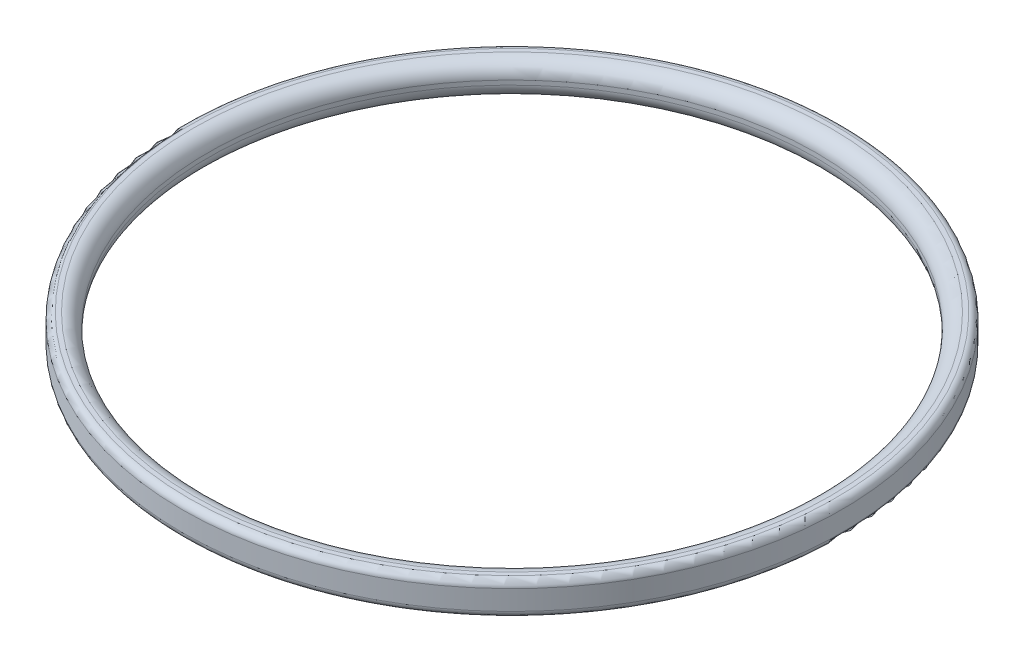
ISO-10303-21;
HEADER;
FILE_DESCRIPTION(('STEP AP214'),'2;1');
FILE_NAME('part.step','',(''),(''),'','','');
FILE_SCHEMA(('AUTOMOTIVE_DESIGN { 1 0 10303 214 1 1 1 1 }'));
ENDSEC;
DATA;
#1=APPLICATION_CONTEXT('core data for automotive mechanical design processes');
#2=APPLICATION_PROTOCOL_DEFINITION('international standard','automotive_design',2000,#1);
#3=PRODUCT_CONTEXT('',#1,'mechanical');
#4=PRODUCT('Part','Part','',(#3));
#5=PRODUCT_RELATED_PRODUCT_CATEGORY('part','',(#4));
#6=PRODUCT_DEFINITION_FORMATION('','',#4);
#7=PRODUCT_DEFINITION_CONTEXT('part definition',#1,'design');
#8=PRODUCT_DEFINITION('design','',#6,#7);
#9=PRODUCT_DEFINITION_SHAPE('','',#8);
#10=(LENGTH_UNIT() NAMED_UNIT(*) SI_UNIT(.MILLI.,.METRE.));
#11=(NAMED_UNIT(*) PLANE_ANGLE_UNIT() SI_UNIT($,.RADIAN.));
#12=(NAMED_UNIT(*) SI_UNIT($,.STERADIAN.) SOLID_ANGLE_UNIT());
#13=UNCERTAINTY_MEASURE_WITH_UNIT(LENGTH_MEASURE(1.E-05),#10,'distance_accuracy_value','');
#14=(GEOMETRIC_REPRESENTATION_CONTEXT(3) GLOBAL_UNCERTAINTY_ASSIGNED_CONTEXT((#13)) GLOBAL_UNIT_ASSIGNED_CONTEXT((#10,
#11,#12)) REPRESENTATION_CONTEXT('',''));
#15=CARTESIAN_POINT('',(0.,0.,0.));
#16=DIRECTION('',(0.,0.,1.));
#17=DIRECTION('',(1.,0.,0.));
#18=AXIS2_PLACEMENT_3D('',#15,#16,#17);
#19=CARTESIAN_POINT('',(0.,-55.,0.));
#20=DIRECTION('',(0.,-1.,0.));
#21=DIRECTION('',(0.,0.,-1.));
#22=AXIS2_PLACEMENT_3D('',#19,#20,#21);
#23=CYLINDRICAL_SURFACE('',#22,38.1);
#24=CARTESIAN_POINT('',(0.,0.761999999999999,0.));
#25=DIRECTION('',(0.,-1.,0.));
#26=DIRECTION('',(0.,0.,-1.));
#27=AXIS2_PLACEMENT_3D('',#24,#25,#26);
#28=CIRCLE('',#27,38.1);
#29=CARTESIAN_POINT('',(0.,0.761999999999999,-38.1));
#30=VERTEX_POINT('',#29);
#31=EDGE_CURVE('E43',#30,#30,#28,.F.);
#32=ORIENTED_EDGE('',*,*,#31,.T.);
#33=EDGE_LOOP('',(#32));
#34=FACE_BOUND('',#33,.T.);
#35=CARTESIAN_POINT('',(0.,3.048,0.));
#36=DIRECTION('',(0.,1.,0.));
#37=DIRECTION('',(0.,0.,1.));
#38=AXIS2_PLACEMENT_3D('',#35,#36,#37);
#39=CIRCLE('',#38,38.1);
#40=CARTESIAN_POINT('',(0.,3.048,38.1));
#41=VERTEX_POINT('',#40);
#42=EDGE_CURVE('E47',#41,#41,#39,.F.);
#43=ORIENTED_EDGE('',*,*,#42,.T.);
#44=EDGE_LOOP('',(#43));
#45=FACE_BOUND('',#44,.T.);
#46=ADVANCED_FACE('F36',(#34,#45),#23,.T.);
#47=CARTESIAN_POINT('',(38.1,0.,0.));
#48=DIRECTION('',(0.,-1.,0.));
#49=DIRECTION('',(0.,0.,-1.));
#50=AXIS2_PLACEMENT_3D('',#47,#48,#49);
#51=PLANE('',#50);
#52=CARTESIAN_POINT('',(0.,0.,0.));
#53=DIRECTION('',(0.,-1.,0.));
#54=DIRECTION('',(0.,0.,-1.));
#55=AXIS2_PLACEMENT_3D('',#52,#53,#54);
#56=CIRCLE('',#55,37.338);
#57=CARTESIAN_POINT('',(0.,0.,-37.338));
#58=VERTEX_POINT('',#57);
#59=EDGE_CURVE('E51',#58,#58,#56,.T.);
#60=ORIENTED_EDGE('',*,*,#59,.T.);
#61=EDGE_LOOP('',(#60));
#62=FACE_BOUND('',#61,.T.);
#63=CARTESIAN_POINT('',(0.,0.,0.));
#64=DIRECTION('',(0.,-1.,0.));
#65=DIRECTION('',(0.,0.,-1.));
#66=AXIS2_PLACEMENT_3D('',#63,#64,#65);
#67=CIRCLE('',#66,36.83);
#68=CARTESIAN_POINT('',(0.,0.,-36.83));
#69=VERTEX_POINT('',#68);
#70=EDGE_CURVE('E59',#69,#69,#67,.F.);
#71=ORIENTED_EDGE('',*,*,#70,.T.);
#72=EDGE_LOOP('',(#71));
#73=FACE_BOUND('',#72,.T.);
#74=ADVANCED_FACE('F88',(#62,#73),#51,.T.);
#75=CARTESIAN_POINT('',(0.,-55.,0.));
#76=DIRECTION('',(0.,-1.,0.));
#77=DIRECTION('',(0.,0.,-1.));
#78=AXIS2_PLACEMENT_3D('',#75,#76,#77);
#79=CYLINDRICAL_SURFACE('',#78,35.179);
#80=CARTESIAN_POINT('',(0.,1.651,0.));
#81=DIRECTION('',(0.,-1.,0.));
#82=DIRECTION('',(0.,0.,-1.));
#83=AXIS2_PLACEMENT_3D('',#80,#81,#82);
#84=CIRCLE('',#83,35.179);
#85=CARTESIAN_POINT('',(0.,1.651,-35.179));
#86=VERTEX_POINT('',#85);
#87=EDGE_CURVE('E62',#86,#86,#84,.T.);
#88=ORIENTED_EDGE('',*,*,#87,.T.);
#89=EDGE_LOOP('',(#88));
#90=FACE_BOUND('',#89,.T.);
#91=CARTESIAN_POINT('',(0.,2.159,0.));
#92=DIRECTION('',(0.,1.,0.));
#93=DIRECTION('',(0.,0.,1.));
#94=AXIS2_PLACEMENT_3D('',#91,#92,#93);
#95=CIRCLE('',#94,35.179);
#96=CARTESIAN_POINT('',(0.,2.159,35.179));
#97=VERTEX_POINT('',#96);
#98=EDGE_CURVE('E65',#97,#97,#95,.T.);
#99=ORIENTED_EDGE('',*,*,#98,.T.);
#100=EDGE_LOOP('',(#99));
#101=FACE_BOUND('',#100,.T.);
#102=ADVANCED_FACE('F69',(#90,#101),#79,.F.);
#103=CARTESIAN_POINT('',(35.179,3.81,0.));
#104=DIRECTION('',(0.,1.,0.));
#105=DIRECTION('',(0.,0.,1.));
#106=AXIS2_PLACEMENT_3D('',#103,#104,#105);
#107=PLANE('',#106);
#108=CARTESIAN_POINT('',(0.,3.81,0.));
#109=DIRECTION('',(0.,1.,0.));
#110=DIRECTION('',(0.,0.,1.));
#111=AXIS2_PLACEMENT_3D('',#108,#109,#110);
#112=CIRCLE('',#111,37.338);
#113=CARTESIAN_POINT('',(0.,3.81,37.338));
#114=VERTEX_POINT('',#113);
#115=EDGE_CURVE('E10',#114,#114,#112,.T.);
#116=ORIENTED_EDGE('',*,*,#115,.T.);
#117=EDGE_LOOP('',(#116));
#118=FACE_BOUND('',#117,.T.);
#119=CARTESIAN_POINT('',(0.,3.81,0.));
#120=DIRECTION('',(0.,1.,0.));
#121=DIRECTION('',(0.,0.,1.));
#122=AXIS2_PLACEMENT_3D('',#119,#120,#121);
#123=CIRCLE('',#122,36.83);
#124=CARTESIAN_POINT('',(0.,3.81,36.83));
#125=VERTEX_POINT('',#124);
#126=EDGE_CURVE('E56',#125,#125,#123,.F.);
#127=ORIENTED_EDGE('',*,*,#126,.T.);
#128=EDGE_LOOP('',(#127));
#129=FACE_BOUND('',#128,.T.);
#130=ADVANCED_FACE('F79',(#118,#129),#107,.T.);
#131=CARTESIAN_POINT('',(0.,1.651,0.));
#132=DIRECTION('',(0.,-1.,0.));
#133=DIRECTION('',(0.,0.,-1.));
#134=AXIS2_PLACEMENT_3D('',#131,#132,#133);
#135=TOROIDAL_SURFACE('',#134,36.83,1.651);
#136=ORIENTED_EDGE('',*,*,#70,.F.);
#137=EDGE_LOOP('',(#136));
#138=FACE_BOUND('',#137,.T.);
#139=ORIENTED_EDGE('',*,*,#87,.F.);
#140=EDGE_LOOP('',(#139));
#141=FACE_BOUND('',#140,.T.);
#142=ADVANCED_FACE('F75',(#138,#141),#135,.T.);
#143=CARTESIAN_POINT('',(0.,2.159,0.));
#144=DIRECTION('',(0.,1.,0.));
#145=DIRECTION('',(0.,0.,1.));
#146=AXIS2_PLACEMENT_3D('',#143,#144,#145);
#147=TOROIDAL_SURFACE('',#146,36.83,1.651);
#148=ORIENTED_EDGE('',*,*,#98,.F.);
#149=EDGE_LOOP('',(#148));
#150=FACE_BOUND('',#149,.T.);
#151=ORIENTED_EDGE('',*,*,#126,.F.);
#152=EDGE_LOOP('',(#151));
#153=FACE_BOUND('',#152,.T.);
#154=ADVANCED_FACE('F71',(#150,#153),#147,.T.);
#155=CARTESIAN_POINT('',(0.,0.761999999999999,0.));
#156=DIRECTION('',(0.,-1.,0.));
#157=DIRECTION('',(0.,0.,-1.));
#158=AXIS2_PLACEMENT_3D('',#155,#156,#157);
#159=TOROIDAL_SURFACE('',#158,37.338,0.762);
#160=ORIENTED_EDGE('',*,*,#31,.F.);
#161=EDGE_LOOP('',(#160));
#162=FACE_BOUND('',#161,.T.);
#163=ORIENTED_EDGE('',*,*,#59,.F.);
#164=EDGE_LOOP('',(#163));
#165=FACE_BOUND('',#164,.T.);
#166=ADVANCED_FACE('F74',(#162,#165),#159,.T.);
#167=CARTESIAN_POINT('',(0.,3.048,0.));
#168=DIRECTION('',(0.,1.,0.));
#169=DIRECTION('',(0.,0.,1.));
#170=AXIS2_PLACEMENT_3D('',#167,#168,#169);
#171=TOROIDAL_SURFACE('',#170,37.338,0.762);
#172=ORIENTED_EDGE('',*,*,#115,.F.);
#173=EDGE_LOOP('',(#172));
#174=FACE_BOUND('',#173,.T.);
#175=ORIENTED_EDGE('',*,*,#42,.F.);
#176=EDGE_LOOP('',(#175));
#177=FACE_BOUND('',#176,.T.);
#178=ADVANCED_FACE('F38',(#174,#177),#171,.T.);
#179=CLOSED_SHELL('',(#46,#74,#102,#130,#142,#154,#166,#178));
#180=MANIFOLD_SOLID_BREP('B2',#179);
#181=ADVANCED_BREP_SHAPE_REPRESENTATION('',(#18,#180),#14);
#182=SHAPE_DEFINITION_REPRESENTATION(#9,#181);
ENDSEC;
END-ISO-10303-21;
